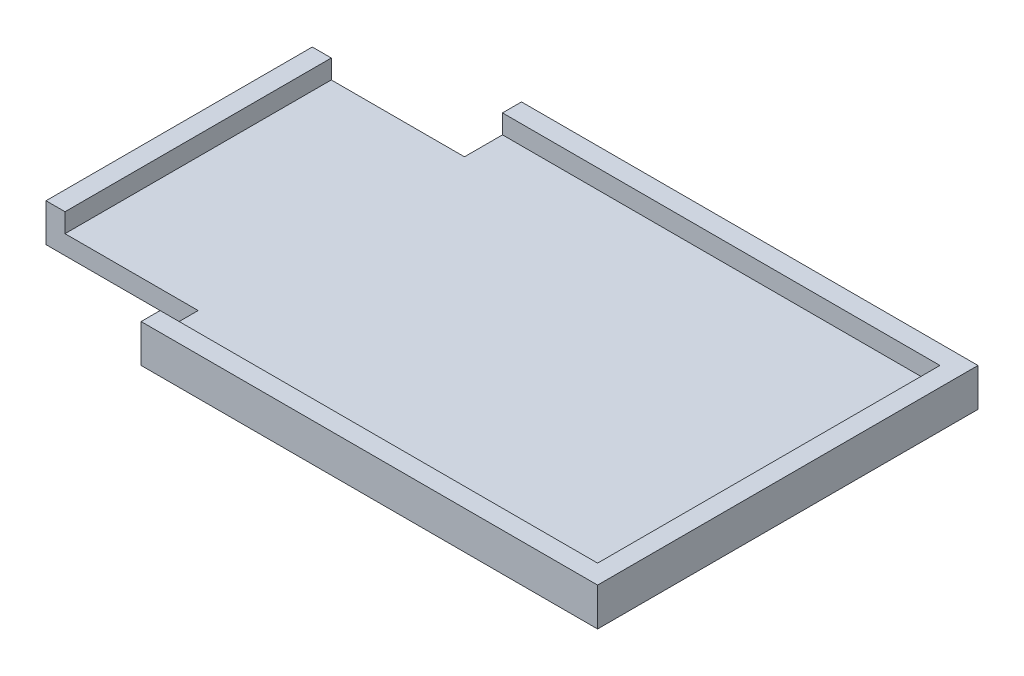
ISO-10303-21;
HEADER;
FILE_DESCRIPTION(('STEP AP214'),'2;1');
FILE_NAME('part.step','',(''),(''),'','','');
FILE_SCHEMA(('AUTOMOTIVE_DESIGN { 1 0 10303 214 1 1 1 1 }'));
ENDSEC;
DATA;
#1=APPLICATION_CONTEXT('core data for automotive mechanical design processes');
#2=APPLICATION_PROTOCOL_DEFINITION('international standard','automotive_design',2000,#1);
#3=PRODUCT_CONTEXT('',#1,'mechanical');
#4=PRODUCT('Part','Part','',(#3));
#5=PRODUCT_RELATED_PRODUCT_CATEGORY('part','',(#4));
#6=PRODUCT_DEFINITION_FORMATION('','',#4);
#7=PRODUCT_DEFINITION_CONTEXT('part definition',#1,'design');
#8=PRODUCT_DEFINITION('design','',#6,#7);
#9=PRODUCT_DEFINITION_SHAPE('','',#8);
#10=(LENGTH_UNIT() NAMED_UNIT(*) SI_UNIT(.MILLI.,.METRE.));
#11=(NAMED_UNIT(*) PLANE_ANGLE_UNIT() SI_UNIT($,.RADIAN.));
#12=(NAMED_UNIT(*) SI_UNIT($,.STERADIAN.) SOLID_ANGLE_UNIT());
#13=UNCERTAINTY_MEASURE_WITH_UNIT(LENGTH_MEASURE(1.E-05),#10,'distance_accuracy_value','');
#14=(GEOMETRIC_REPRESENTATION_CONTEXT(3) GLOBAL_UNCERTAINTY_ASSIGNED_CONTEXT((#13)) GLOBAL_UNIT_ASSIGNED_CONTEXT((#10,
#11,#12)) REPRESENTATION_CONTEXT('',''));
#15=CARTESIAN_POINT('',(0.,0.,0.));
#16=DIRECTION('',(0.,0.,1.));
#17=DIRECTION('',(1.,0.,0.));
#18=AXIS2_PLACEMENT_3D('',#15,#16,#17);
#19=CARTESIAN_POINT('',(0.,12.7,0.));
#20=DIRECTION('',(0.,-1.,0.));
#21=DIRECTION('',(0.,0.,-1.));
#22=AXIS2_PLACEMENT_3D('',#19,#20,#21);
#23=PLANE('',#22);
#24=DIRECTION('',(1.,0.,0.));
#25=VECTOR('',#24,1.);
#26=CARTESIAN_POINT('',(-101.6,12.7,44.45));
#27=LINE('',#26,#25);
#28=CARTESIAN_POINT('',(-101.6,12.7,44.45));
#29=VERTEX_POINT('',#28);
#30=CARTESIAN_POINT('',(-95.25,12.7,44.45));
#31=VERTEX_POINT('',#30);
#32=EDGE_CURVE('E161',#29,#31,#27,.T.);
#33=ORIENTED_EDGE('',*,*,#32,.T.);
#34=DIRECTION('',(0.,0.,-1.));
#35=VECTOR('',#34,1.);
#36=CARTESIAN_POINT('',(-95.25,12.7,0.));
#37=LINE('',#36,#35);
#38=CARTESIAN_POINT('',(-95.25,12.7,-44.45));
#39=VERTEX_POINT('',#38);
#40=EDGE_CURVE('E41',#31,#39,#37,.T.);
#41=ORIENTED_EDGE('',*,*,#40,.T.);
#42=DIRECTION('',(-1.,0.,0.));
#43=VECTOR('',#42,1.);
#44=CARTESIAN_POINT('',(-101.6,12.7,-44.45));
#45=LINE('',#44,#43);
#46=CARTESIAN_POINT('',(-101.6,12.7,-44.45));
#47=VERTEX_POINT('',#46);
#48=EDGE_CURVE('E138',#39,#47,#45,.T.);
#49=ORIENTED_EDGE('',*,*,#48,.T.);
#50=DIRECTION('',(0.,0.,1.));
#51=VECTOR('',#50,1.);
#52=CARTESIAN_POINT('',(-101.6,12.7,-44.45));
#53=LINE('',#52,#51);
#54=EDGE_CURVE('E57',#47,#29,#53,.T.);
#55=ORIENTED_EDGE('',*,*,#54,.T.);
#56=EDGE_LOOP('',(#33,#41,#49,#55));
#57=FACE_BOUND('',#56,.T.);
#58=ADVANCED_FACE('F33',(#57),#23,.F.);
#59=CARTESIAN_POINT('',(-101.6,12.7,44.45));
#60=DIRECTION('',(0.,0.,-1.));
#61=DIRECTION('',(-1.,0.,0.));
#62=AXIS2_PLACEMENT_3D('',#59,#60,#61);
#63=PLANE('',#62);
#64=DIRECTION('',(1.,0.,0.));
#65=VECTOR('',#64,1.);
#66=CARTESIAN_POINT('',(-101.6,6.35,44.45));
#67=LINE('',#66,#65);
#68=CARTESIAN_POINT('',(-95.25,6.35,44.45));
#69=VERTEX_POINT('',#68);
#70=CARTESIAN_POINT('',(-50.8,6.35,44.45));
#71=VERTEX_POINT('',#70);
#72=EDGE_CURVE('E149',#69,#71,#67,.T.);
#73=ORIENTED_EDGE('',*,*,#72,.F.);
#74=DIRECTION('',(0.,1.,0.));
#75=VECTOR('',#74,1.);
#76=CARTESIAN_POINT('',(-95.25,12.7,44.45));
#77=LINE('',#76,#75);
#78=EDGE_CURVE('E200',#69,#31,#77,.T.);
#79=ORIENTED_EDGE('',*,*,#78,.T.);
#80=ORIENTED_EDGE('',*,*,#32,.F.);
#81=DIRECTION('',(0.,-1.,0.));
#82=VECTOR('',#81,1.);
#83=CARTESIAN_POINT('',(-101.6,12.7,44.45));
#84=LINE('',#83,#82);
#85=CARTESIAN_POINT('',(-101.6,0.,44.45));
#86=VERTEX_POINT('',#85);
#87=EDGE_CURVE('E144',#29,#86,#84,.T.);
#88=ORIENTED_EDGE('',*,*,#87,.T.);
#89=DIRECTION('',(1.,0.,0.));
#90=VECTOR('',#89,1.);
#91=CARTESIAN_POINT('',(-101.6,0.,44.45));
#92=LINE('',#91,#90);
#93=CARTESIAN_POINT('',(-50.8,0.,44.45));
#94=VERTEX_POINT('',#93);
#95=EDGE_CURVE('E145',#86,#94,#92,.T.);
#96=ORIENTED_EDGE('',*,*,#95,.T.);
#97=DIRECTION('',(0.,-1.,0.));
#98=VECTOR('',#97,1.);
#99=CARTESIAN_POINT('',(-50.8,12.7,44.45));
#100=LINE('',#99,#98);
#101=EDGE_CURVE('E173',#71,#94,#100,.T.);
#102=ORIENTED_EDGE('',*,*,#101,.F.);
#103=EDGE_LOOP('',(#73,#79,#80,#88,#96,#102));
#104=FACE_BOUND('',#103,.T.);
#105=ADVANCED_FACE('F35',(#104),#63,.F.);
#106=CARTESIAN_POINT('',(-50.8,12.7,44.45));
#107=DIRECTION('',(1.,0.,0.));
#108=DIRECTION('',(0.,0.,-1.));
#109=AXIS2_PLACEMENT_3D('',#106,#107,#108);
#110=PLANE('',#109);
#111=DIRECTION('',(0.,0.,1.));
#112=VECTOR('',#111,1.);
#113=CARTESIAN_POINT('',(-50.8,12.7,44.45));
#114=LINE('',#113,#112);
#115=CARTESIAN_POINT('',(-50.8,12.7,57.15));
#116=VERTEX_POINT('',#115);
#117=CARTESIAN_POINT('',(-50.8,12.7,63.5));
#118=VERTEX_POINT('',#117);
#119=EDGE_CURVE('E98',#116,#118,#114,.T.);
#120=ORIENTED_EDGE('',*,*,#119,.F.);
#121=DIRECTION('',(0.,-1.,0.));
#122=VECTOR('',#121,1.);
#123=CARTESIAN_POINT('',(-50.8,12.7,57.15));
#124=LINE('',#123,#122);
#125=CARTESIAN_POINT('',(-50.8,6.35,57.15));
#126=VERTEX_POINT('',#125);
#127=EDGE_CURVE('E48',#116,#126,#124,.T.);
#128=ORIENTED_EDGE('',*,*,#127,.T.);
#129=DIRECTION('',(0.,0.,1.));
#130=VECTOR('',#129,1.);
#131=CARTESIAN_POINT('',(-50.8,6.35,44.45));
#132=LINE('',#131,#130);
#133=EDGE_CURVE('E257',#71,#126,#132,.T.);
#134=ORIENTED_EDGE('',*,*,#133,.F.);
#135=ORIENTED_EDGE('',*,*,#101,.T.);
#136=DIRECTION('',(0.,0.,1.));
#137=VECTOR('',#136,1.);
#138=CARTESIAN_POINT('',(-50.8,0.,44.45));
#139=LINE('',#138,#137);
#140=CARTESIAN_POINT('',(-50.8,0.,63.5));
#141=VERTEX_POINT('',#140);
#142=EDGE_CURVE('E148',#94,#141,#139,.T.);
#143=ORIENTED_EDGE('',*,*,#142,.T.);
#144=DIRECTION('',(0.,-1.,0.));
#145=VECTOR('',#144,1.);
#146=CARTESIAN_POINT('',(-50.8,12.7,63.5));
#147=LINE('',#146,#145);
#148=EDGE_CURVE('E170',#118,#141,#147,.T.);
#149=ORIENTED_EDGE('',*,*,#148,.F.);
#150=EDGE_LOOP('',(#120,#128,#134,#135,#143,#149));
#151=FACE_BOUND('',#150,.T.);
#152=ADVANCED_FACE('F263',(#151),#110,.F.);
#153=CARTESIAN_POINT('',(-50.8,12.7,63.5));
#154=DIRECTION('',(0.,0.,-1.));
#155=DIRECTION('',(-1.,0.,0.));
#156=AXIS2_PLACEMENT_3D('',#153,#154,#155);
#157=PLANE('',#156);
#158=DIRECTION('',(1.,0.,0.));
#159=VECTOR('',#158,1.);
#160=CARTESIAN_POINT('',(-50.8,0.,63.5));
#161=LINE('',#160,#159);
#162=CARTESIAN_POINT('',(101.6,0.,63.5));
#163=VERTEX_POINT('',#162);
#164=EDGE_CURVE('E151',#141,#163,#161,.T.);
#165=ORIENTED_EDGE('',*,*,#164,.T.);
#166=DIRECTION('',(0.,-1.,0.));
#167=VECTOR('',#166,1.);
#168=CARTESIAN_POINT('',(101.6,12.7,63.5));
#169=LINE('',#168,#167);
#170=CARTESIAN_POINT('',(101.6,12.7,63.5));
#171=VERTEX_POINT('',#170);
#172=EDGE_CURVE('E167',#171,#163,#169,.T.);
#173=ORIENTED_EDGE('',*,*,#172,.F.);
#174=DIRECTION('',(1.,0.,0.));
#175=VECTOR('',#174,1.);
#176=CARTESIAN_POINT('',(-50.8,12.7,63.5));
#177=LINE('',#176,#175);
#178=EDGE_CURVE('E202',#118,#171,#177,.T.);
#179=ORIENTED_EDGE('',*,*,#178,.F.);
#180=ORIENTED_EDGE('',*,*,#148,.T.);
#181=EDGE_LOOP('',(#165,#173,#179,#180));
#182=FACE_BOUND('',#181,.T.);
#183=ADVANCED_FACE('F210',(#182),#157,.F.);
#184=CARTESIAN_POINT('',(101.6,12.7,-63.5));
#185=DIRECTION('',(-1.,0.,0.));
#186=DIRECTION('',(0.,0.,1.));
#187=AXIS2_PLACEMENT_3D('',#184,#185,#186);
#188=PLANE('',#187);
#189=DIRECTION('',(0.,0.,-1.));
#190=VECTOR('',#189,1.);
#191=CARTESIAN_POINT('',(101.6,0.,-63.5));
#192=LINE('',#191,#190);
#193=CARTESIAN_POINT('',(101.6,0.,-63.5));
#194=VERTEX_POINT('',#193);
#195=EDGE_CURVE('E153',#163,#194,#192,.T.);
#196=ORIENTED_EDGE('',*,*,#195,.T.);
#197=DIRECTION('',(0.,-1.,0.));
#198=VECTOR('',#197,1.);
#199=CARTESIAN_POINT('',(101.6,12.7,-63.5));
#200=LINE('',#199,#198);
#201=CARTESIAN_POINT('',(101.6,12.7,-63.5));
#202=VERTEX_POINT('',#201);
#203=EDGE_CURVE('E130',#202,#194,#200,.T.);
#204=ORIENTED_EDGE('',*,*,#203,.F.);
#205=DIRECTION('',(0.,0.,-1.));
#206=VECTOR('',#205,1.);
#207=CARTESIAN_POINT('',(101.6,12.7,-63.5));
#208=LINE('',#207,#206);
#209=EDGE_CURVE('E117',#171,#202,#208,.T.);
#210=ORIENTED_EDGE('',*,*,#209,.F.);
#211=ORIENTED_EDGE('',*,*,#172,.T.);
#212=EDGE_LOOP('',(#196,#204,#210,#211));
#213=FACE_BOUND('',#212,.T.);
#214=ADVANCED_FACE('F214',(#213),#188,.F.);
#215=CARTESIAN_POINT('',(-50.8,12.7,-63.5));
#216=DIRECTION('',(0.,0.,1.));
#217=DIRECTION('',(1.,0.,0.));
#218=AXIS2_PLACEMENT_3D('',#215,#216,#217);
#219=PLANE('',#218);
#220=DIRECTION('',(-1.,0.,0.));
#221=VECTOR('',#220,1.);
#222=CARTESIAN_POINT('',(-50.8,0.,-63.5));
#223=LINE('',#222,#221);
#224=CARTESIAN_POINT('',(-50.8,0.,-63.5));
#225=VERTEX_POINT('',#224);
#226=EDGE_CURVE('E126',#194,#225,#223,.T.);
#227=ORIENTED_EDGE('',*,*,#226,.T.);
#228=DIRECTION('',(0.,-1.,0.));
#229=VECTOR('',#228,1.);
#230=CARTESIAN_POINT('',(-50.8,12.7,-63.5));
#231=LINE('',#230,#229);
#232=CARTESIAN_POINT('',(-50.8,12.7,-63.5));
#233=VERTEX_POINT('',#232);
#234=EDGE_CURVE('E123',#233,#225,#231,.T.);
#235=ORIENTED_EDGE('',*,*,#234,.F.);
#236=DIRECTION('',(-1.,0.,0.));
#237=VECTOR('',#236,1.);
#238=CARTESIAN_POINT('',(-50.8,12.7,-63.5));
#239=LINE('',#238,#237);
#240=EDGE_CURVE('E109',#202,#233,#239,.T.);
#241=ORIENTED_EDGE('',*,*,#240,.F.);
#242=ORIENTED_EDGE('',*,*,#203,.T.);
#243=EDGE_LOOP('',(#227,#235,#241,#242));
#244=FACE_BOUND('',#243,.T.);
#245=ADVANCED_FACE('F124',(#244),#219,.F.);
#246=CARTESIAN_POINT('',(-50.8,12.7,-44.45));
#247=DIRECTION('',(1.,0.,0.));
#248=DIRECTION('',(0.,0.,-1.));
#249=AXIS2_PLACEMENT_3D('',#246,#247,#248);
#250=PLANE('',#249);
#251=DIRECTION('',(0.,0.,1.));
#252=VECTOR('',#251,1.);
#253=CARTESIAN_POINT('',(-50.8,6.35,-44.45));
#254=LINE('',#253,#252);
#255=CARTESIAN_POINT('',(-50.8,6.35,-57.15));
#256=VERTEX_POINT('',#255);
#257=CARTESIAN_POINT('',(-50.8,6.35,-44.45));
#258=VERTEX_POINT('',#257);
#259=EDGE_CURVE('E220',#256,#258,#254,.T.);
#260=ORIENTED_EDGE('',*,*,#259,.F.);
#261=DIRECTION('',(0.,1.,0.));
#262=VECTOR('',#261,1.);
#263=CARTESIAN_POINT('',(-50.8,12.7,-57.15));
#264=LINE('',#263,#262);
#265=CARTESIAN_POINT('',(-50.8,12.7,-57.15));
#266=VERTEX_POINT('',#265);
#267=EDGE_CURVE('E137',#256,#266,#264,.T.);
#268=ORIENTED_EDGE('',*,*,#267,.T.);
#269=DIRECTION('',(0.,0.,1.));
#270=VECTOR('',#269,1.);
#271=CARTESIAN_POINT('',(-50.8,12.7,-44.45));
#272=LINE('',#271,#270);
#273=EDGE_CURVE('E115',#233,#266,#272,.T.);
#274=ORIENTED_EDGE('',*,*,#273,.F.);
#275=ORIENTED_EDGE('',*,*,#234,.T.);
#276=DIRECTION('',(0.,0.,1.));
#277=VECTOR('',#276,1.);
#278=CARTESIAN_POINT('',(-50.8,0.,-44.45));
#279=LINE('',#278,#277);
#280=CARTESIAN_POINT('',(-50.8,0.,-44.45));
#281=VERTEX_POINT('',#280);
#282=EDGE_CURVE('E156',#225,#281,#279,.T.);
#283=ORIENTED_EDGE('',*,*,#282,.T.);
#284=DIRECTION('',(0.,-1.,0.));
#285=VECTOR('',#284,1.);
#286=CARTESIAN_POINT('',(-50.8,12.7,-44.45));
#287=LINE('',#286,#285);
#288=EDGE_CURVE('E131',#258,#281,#287,.T.);
#289=ORIENTED_EDGE('',*,*,#288,.F.);
#290=EDGE_LOOP('',(#260,#268,#274,#275,#283,#289));
#291=FACE_BOUND('',#290,.T.);
#292=ADVANCED_FACE('F135',(#291),#250,.F.);
#293=CARTESIAN_POINT('',(-101.6,12.7,-44.45));
#294=DIRECTION('',(0.,0.,1.));
#295=DIRECTION('',(1.,0.,0.));
#296=AXIS2_PLACEMENT_3D('',#293,#294,#295);
#297=PLANE('',#296);
#298=ORIENTED_EDGE('',*,*,#48,.F.);
#299=DIRECTION('',(0.,-1.,0.));
#300=VECTOR('',#299,1.);
#301=CARTESIAN_POINT('',(-95.25,12.7,-44.45));
#302=LINE('',#301,#300);
#303=CARTESIAN_POINT('',(-95.25,6.35,-44.45));
#304=VERTEX_POINT('',#303);
#305=EDGE_CURVE('E194',#39,#304,#302,.T.);
#306=ORIENTED_EDGE('',*,*,#305,.T.);
#307=DIRECTION('',(-1.,0.,0.));
#308=VECTOR('',#307,1.);
#309=CARTESIAN_POINT('',(-101.6,6.35,-44.45));
#310=LINE('',#309,#308);
#311=EDGE_CURVE('E11',#258,#304,#310,.T.);
#312=ORIENTED_EDGE('',*,*,#311,.F.);
#313=ORIENTED_EDGE('',*,*,#288,.T.);
#314=DIRECTION('',(-1.,0.,0.));
#315=VECTOR('',#314,1.);
#316=CARTESIAN_POINT('',(-101.6,0.,-44.45));
#317=LINE('',#316,#315);
#318=CARTESIAN_POINT('',(-101.6,0.,-44.45));
#319=VERTEX_POINT('',#318);
#320=EDGE_CURVE('E158',#281,#319,#317,.T.);
#321=ORIENTED_EDGE('',*,*,#320,.T.);
#322=DIRECTION('',(0.,-1.,0.));
#323=VECTOR('',#322,1.);
#324=CARTESIAN_POINT('',(-101.6,12.7,-44.45));
#325=LINE('',#324,#323);
#326=EDGE_CURVE('E163',#47,#319,#325,.T.);
#327=ORIENTED_EDGE('',*,*,#326,.F.);
#328=EDGE_LOOP('',(#298,#306,#312,#313,#321,#327));
#329=FACE_BOUND('',#328,.T.);
#330=ADVANCED_FACE('F191',(#329),#297,.F.);
#331=CARTESIAN_POINT('',(-101.6,12.7,-44.45));
#332=DIRECTION('',(1.,0.,0.));
#333=DIRECTION('',(0.,0.,-1.));
#334=AXIS2_PLACEMENT_3D('',#331,#332,#333);
#335=PLANE('',#334);
#336=DIRECTION('',(0.,0.,1.));
#337=VECTOR('',#336,1.);
#338=CARTESIAN_POINT('',(-101.6,0.,-44.45));
#339=LINE('',#338,#337);
#340=EDGE_CURVE('E90',#319,#86,#339,.T.);
#341=ORIENTED_EDGE('',*,*,#340,.T.);
#342=ORIENTED_EDGE('',*,*,#87,.F.);
#343=ORIENTED_EDGE('',*,*,#54,.F.);
#344=ORIENTED_EDGE('',*,*,#326,.T.);
#345=EDGE_LOOP('',(#341,#342,#343,#344));
#346=FACE_BOUND('',#345,.T.);
#347=ADVANCED_FACE('F196',(#346),#335,.F.);
#348=ORIENTED_EDGE('',*,*,#273,.T.);
#349=DIRECTION('',(-1.,0.,0.));
#350=VECTOR('',#349,1.);
#351=CARTESIAN_POINT('',(-95.25,12.7,-57.15));
#352=LINE('',#351,#350);
#353=CARTESIAN_POINT('',(95.25,12.7,-57.15));
#354=VERTEX_POINT('',#353);
#355=EDGE_CURVE('E232',#354,#266,#352,.T.);
#356=ORIENTED_EDGE('',*,*,#355,.F.);
#357=DIRECTION('',(0.,0.,-1.));
#358=VECTOR('',#357,1.);
#359=CARTESIAN_POINT('',(95.25,12.7,-57.15));
#360=LINE('',#359,#358);
#361=CARTESIAN_POINT('',(95.25,12.7,57.15));
#362=VERTEX_POINT('',#361);
#363=EDGE_CURVE('E238',#362,#354,#360,.T.);
#364=ORIENTED_EDGE('',*,*,#363,.F.);
#365=DIRECTION('',(-1.,0.,0.));
#366=VECTOR('',#365,1.);
#367=CARTESIAN_POINT('',(0.,12.7,57.15));
#368=LINE('',#367,#366);
#369=EDGE_CURVE('E175',#362,#116,#368,.T.);
#370=ORIENTED_EDGE('',*,*,#369,.T.);
#371=ORIENTED_EDGE('',*,*,#119,.T.);
#372=ORIENTED_EDGE('',*,*,#178,.T.);
#373=ORIENTED_EDGE('',*,*,#209,.T.);
#374=ORIENTED_EDGE('',*,*,#240,.T.);
#375=EDGE_LOOP('',(#348,#356,#364,#370,#371,#372,#373,#374));
#376=FACE_BOUND('',#375,.T.);
#377=ADVANCED_FACE('F111',(#376),#23,.F.);
#378=CARTESIAN_POINT('',(0.,0.,0.));
#379=DIRECTION('',(0.,-1.,0.));
#380=DIRECTION('',(0.,0.,-1.));
#381=AXIS2_PLACEMENT_3D('',#378,#379,#380);
#382=PLANE('',#381);
#383=ORIENTED_EDGE('',*,*,#95,.F.);
#384=ORIENTED_EDGE('',*,*,#340,.F.);
#385=ORIENTED_EDGE('',*,*,#320,.F.);
#386=ORIENTED_EDGE('',*,*,#282,.F.);
#387=ORIENTED_EDGE('',*,*,#226,.F.);
#388=ORIENTED_EDGE('',*,*,#195,.F.);
#389=ORIENTED_EDGE('',*,*,#164,.F.);
#390=ORIENTED_EDGE('',*,*,#142,.F.);
#391=EDGE_LOOP('',(#383,#384,#385,#386,#387,#388,#389,#390));
#392=FACE_BOUND('',#391,.T.);
#393=ADVANCED_FACE('F216',(#392),#382,.T.);
#394=CARTESIAN_POINT('',(0.,6.35,0.));
#395=DIRECTION('',(0.,1.,0.));
#396=DIRECTION('',(0.,0.,1.));
#397=AXIS2_PLACEMENT_3D('',#394,#395,#396);
#398=PLANE('',#397);
#399=ORIENTED_EDGE('',*,*,#72,.T.);
#400=ORIENTED_EDGE('',*,*,#133,.T.);
#401=DIRECTION('',(1.,0.,0.));
#402=VECTOR('',#401,1.);
#403=CARTESIAN_POINT('',(-95.25,6.35,57.15));
#404=LINE('',#403,#402);
#405=CARTESIAN_POINT('',(95.25,6.35,57.15));
#406=VERTEX_POINT('',#405);
#407=EDGE_CURVE('E231',#126,#406,#404,.T.);
#408=ORIENTED_EDGE('',*,*,#407,.T.);
#409=DIRECTION('',(0.,0.,-1.));
#410=VECTOR('',#409,1.);
#411=CARTESIAN_POINT('',(95.25,6.35,-57.15));
#412=LINE('',#411,#410);
#413=CARTESIAN_POINT('',(95.25,6.35,-57.15));
#414=VERTEX_POINT('',#413);
#415=EDGE_CURVE('E235',#406,#414,#412,.T.);
#416=ORIENTED_EDGE('',*,*,#415,.T.);
#417=DIRECTION('',(-1.,0.,0.));
#418=VECTOR('',#417,1.);
#419=CARTESIAN_POINT('',(-95.25,6.35,-57.15));
#420=LINE('',#419,#418);
#421=EDGE_CURVE('E243',#414,#256,#420,.T.);
#422=ORIENTED_EDGE('',*,*,#421,.T.);
#423=ORIENTED_EDGE('',*,*,#259,.T.);
#424=ORIENTED_EDGE('',*,*,#311,.T.);
#425=DIRECTION('',(0.,0.,1.));
#426=VECTOR('',#425,1.);
#427=CARTESIAN_POINT('',(-95.25,6.35,-57.15));
#428=LINE('',#427,#426);
#429=EDGE_CURVE('E227',#304,#69,#428,.T.);
#430=ORIENTED_EDGE('',*,*,#429,.T.);
#431=EDGE_LOOP('',(#399,#400,#408,#416,#422,#423,#424,#430));
#432=FACE_BOUND('',#431,.T.);
#433=ADVANCED_FACE('F226',(#432),#398,.T.);
#434=CARTESIAN_POINT('',(-95.25,6.35,-57.15));
#435=DIRECTION('',(-1.,0.,0.));
#436=DIRECTION('',(0.,0.,1.));
#437=AXIS2_PLACEMENT_3D('',#434,#435,#436);
#438=PLANE('',#437);
#439=ORIENTED_EDGE('',*,*,#429,.F.);
#440=ORIENTED_EDGE('',*,*,#305,.F.);
#441=ORIENTED_EDGE('',*,*,#40,.F.);
#442=ORIENTED_EDGE('',*,*,#78,.F.);
#443=EDGE_LOOP('',(#439,#440,#441,#442));
#444=FACE_BOUND('',#443,.T.);
#445=ADVANCED_FACE('F230',(#444),#438,.F.);
#446=CARTESIAN_POINT('',(-95.25,6.35,-57.15));
#447=DIRECTION('',(0.,0.,-1.));
#448=DIRECTION('',(-1.,0.,0.));
#449=AXIS2_PLACEMENT_3D('',#446,#447,#448);
#450=PLANE('',#449);
#451=ORIENTED_EDGE('',*,*,#421,.F.);
#452=DIRECTION('',(0.,1.,0.));
#453=VECTOR('',#452,1.);
#454=CARTESIAN_POINT('',(95.25,6.35,-57.15));
#455=LINE('',#454,#453);
#456=EDGE_CURVE('E248',#414,#354,#455,.T.);
#457=ORIENTED_EDGE('',*,*,#456,.T.);
#458=ORIENTED_EDGE('',*,*,#355,.T.);
#459=ORIENTED_EDGE('',*,*,#267,.F.);
#460=EDGE_LOOP('',(#451,#457,#458,#459));
#461=FACE_BOUND('',#460,.T.);
#462=ADVANCED_FACE('F279',(#461),#450,.F.);
#463=CARTESIAN_POINT('',(-95.25,6.35,57.15));
#464=DIRECTION('',(0.,0.,1.));
#465=DIRECTION('',(1.,0.,0.));
#466=AXIS2_PLACEMENT_3D('',#463,#464,#465);
#467=PLANE('',#466);
#468=ORIENTED_EDGE('',*,*,#369,.F.);
#469=DIRECTION('',(0.,1.,0.));
#470=VECTOR('',#469,1.);
#471=CARTESIAN_POINT('',(95.25,6.35,57.15));
#472=LINE('',#471,#470);
#473=EDGE_CURVE('E245',#406,#362,#472,.T.);
#474=ORIENTED_EDGE('',*,*,#473,.F.);
#475=ORIENTED_EDGE('',*,*,#407,.F.);
#476=ORIENTED_EDGE('',*,*,#127,.F.);
#477=EDGE_LOOP('',(#468,#474,#475,#476));
#478=FACE_BOUND('',#477,.T.);
#479=ADVANCED_FACE('F287',(#478),#467,.F.);
#480=CARTESIAN_POINT('',(95.25,6.35,-57.15));
#481=DIRECTION('',(1.,0.,0.));
#482=DIRECTION('',(0.,0.,-1.));
#483=AXIS2_PLACEMENT_3D('',#480,#481,#482);
#484=PLANE('',#483);
#485=ORIENTED_EDGE('',*,*,#363,.T.);
#486=ORIENTED_EDGE('',*,*,#456,.F.);
#487=ORIENTED_EDGE('',*,*,#415,.F.);
#488=ORIENTED_EDGE('',*,*,#473,.T.);
#489=EDGE_LOOP('',(#485,#486,#487,#488));
#490=FACE_BOUND('',#489,.T.);
#491=ADVANCED_FACE('F283',(#490),#484,.F.);
#492=CLOSED_SHELL('',(#58,#105,#152,#183,#214,#245,#292,#330,#347,#377,#393,#433,#445,#462,#479,#491));
#493=MANIFOLD_SOLID_BREP('B2',#492);
#494=ADVANCED_BREP_SHAPE_REPRESENTATION('',(#18,#493),#14);
#495=SHAPE_DEFINITION_REPRESENTATION(#9,#494);
ENDSEC;
END-ISO-10303-21;
